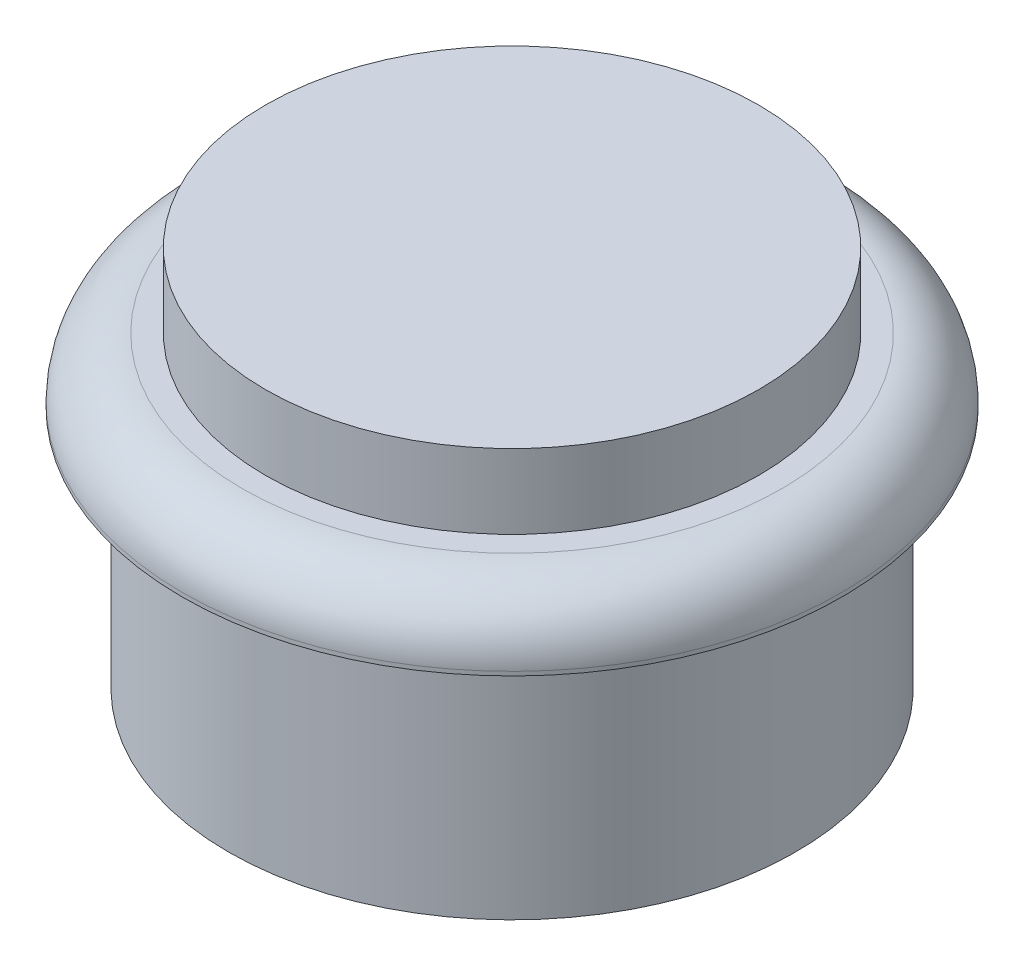
ISO-10303-21;
HEADER;
FILE_DESCRIPTION(('STEP AP214'),'2;1');
FILE_NAME('part.step','',(''),(''),'','','');
FILE_SCHEMA(('AUTOMOTIVE_DESIGN { 1 0 10303 214 1 1 1 1 }'));
ENDSEC;
DATA;
#1=APPLICATION_CONTEXT('core data for automotive mechanical design processes');
#2=APPLICATION_PROTOCOL_DEFINITION('international standard','automotive_design',2000,#1);
#3=PRODUCT_CONTEXT('',#1,'mechanical');
#4=PRODUCT('Part','Part','',(#3));
#5=PRODUCT_RELATED_PRODUCT_CATEGORY('part','',(#4));
#6=PRODUCT_DEFINITION_FORMATION('','',#4);
#7=PRODUCT_DEFINITION_CONTEXT('part definition',#1,'design');
#8=PRODUCT_DEFINITION('design','',#6,#7);
#9=PRODUCT_DEFINITION_SHAPE('','',#8);
#10=(LENGTH_UNIT() NAMED_UNIT(*) SI_UNIT(.MILLI.,.METRE.));
#11=(NAMED_UNIT(*) PLANE_ANGLE_UNIT() SI_UNIT($,.RADIAN.));
#12=(NAMED_UNIT(*) SI_UNIT($,.STERADIAN.) SOLID_ANGLE_UNIT());
#13=UNCERTAINTY_MEASURE_WITH_UNIT(LENGTH_MEASURE(1.E-05),#10,'distance_accuracy_value','');
#14=(GEOMETRIC_REPRESENTATION_CONTEXT(3) GLOBAL_UNCERTAINTY_ASSIGNED_CONTEXT((#13)) GLOBAL_UNIT_ASSIGNED_CONTEXT((#10,
#11,#12)) REPRESENTATION_CONTEXT('',''));
#15=CARTESIAN_POINT('',(0.,0.,0.));
#16=DIRECTION('',(0.,0.,1.));
#17=DIRECTION('',(1.,0.,0.));
#18=AXIS2_PLACEMENT_3D('',#15,#16,#17);
#19=CARTESIAN_POINT('',(0.,-12.2,0.));
#20=DIRECTION('',(0.,1.,0.));
#21=DIRECTION('',(0.,0.,1.));
#22=AXIS2_PLACEMENT_3D('',#19,#20,#21);
#23=CYLINDRICAL_SURFACE('',#22,14.2);
#24=CARTESIAN_POINT('',(0.,-12.2,0.));
#25=DIRECTION('',(0.,1.,0.));
#26=DIRECTION('',(0.,0.,1.));
#27=AXIS2_PLACEMENT_3D('',#24,#25,#26);
#28=CIRCLE('',#27,14.2);
#29=CARTESIAN_POINT('',(0.,-12.2,14.2));
#30=VERTEX_POINT('',#29);
#31=EDGE_CURVE('E48',#30,#30,#28,.T.);
#32=ORIENTED_EDGE('',*,*,#31,.T.);
#33=EDGE_LOOP('',(#32));
#34=FACE_BOUND('',#33,.T.);
#35=CARTESIAN_POINT('',(0.,0.,0.));
#36=DIRECTION('',(0.,1.,0.));
#37=DIRECTION('',(0.,0.,1.));
#38=AXIS2_PLACEMENT_3D('',#35,#36,#37);
#39=CIRCLE('',#38,14.2);
#40=CARTESIAN_POINT('',(0.,0.,14.2));
#41=VERTEX_POINT('',#40);
#42=EDGE_CURVE('E52',#41,#41,#39,.T.);
#43=ORIENTED_EDGE('',*,*,#42,.F.);
#44=EDGE_LOOP('',(#43));
#45=FACE_BOUND('',#44,.T.);
#46=ADVANCED_FACE('F37',(#34,#45),#23,.T.);
#47=CARTESIAN_POINT('',(0.,-12.2,0.));
#48=DIRECTION('',(0.,1.,0.));
#49=DIRECTION('',(0.,0.,1.));
#50=AXIS2_PLACEMENT_3D('',#47,#48,#49);
#51=PLANE('',#50);
#52=ORIENTED_EDGE('',*,*,#31,.F.);
#53=EDGE_LOOP('',(#52));
#54=FACE_BOUND('',#53,.T.);
#55=ADVANCED_FACE('F87',(#54),#51,.F.);
#56=CARTESIAN_POINT('',(0.,3.2,0.));
#57=DIRECTION('',(0.,-1.,0.));
#58=DIRECTION('',(0.,0.,-1.));
#59=AXIS2_PLACEMENT_3D('',#56,#57,#58);
#60=CYLINDRICAL_SURFACE('',#59,16.5);
#61=CARTESIAN_POINT('',(0.,0.2,0.));
#62=DIRECTION('',(0.,1.,0.));
#63=DIRECTION('',(0.,0.,1.));
#64=AXIS2_PLACEMENT_3D('',#61,#62,#63);
#65=CIRCLE('',#64,16.5);
#66=CARTESIAN_POINT('',(0.,0.2,16.5));
#67=VERTEX_POINT('',#66);
#68=EDGE_CURVE('E10',#67,#67,#65,.F.);
#69=ORIENTED_EDGE('',*,*,#68,.T.);
#70=EDGE_LOOP('',(#69));
#71=FACE_BOUND('',#70,.T.);
#72=CARTESIAN_POINT('',(0.,0.,0.));
#73=DIRECTION('',(0.,1.,0.));
#74=DIRECTION('',(0.,0.,1.));
#75=AXIS2_PLACEMENT_3D('',#72,#73,#74);
#76=CIRCLE('',#75,16.5);
#77=CARTESIAN_POINT('',(0.,0.,16.5));
#78=VERTEX_POINT('',#77);
#79=EDGE_CURVE('E56',#78,#78,#76,.T.);
#80=ORIENTED_EDGE('',*,*,#79,.T.);
#81=EDGE_LOOP('',(#80));
#82=FACE_BOUND('',#81,.T.);
#83=ADVANCED_FACE('F78',(#71,#82),#60,.T.);
#84=CARTESIAN_POINT('',(0.,3.2,0.));
#85=DIRECTION('',(0.,1.,0.));
#86=DIRECTION('',(0.,0.,1.));
#87=AXIS2_PLACEMENT_3D('',#84,#85,#86);
#88=PLANE('',#87);
#89=CARTESIAN_POINT('',(0.,3.2,0.));
#90=DIRECTION('',(0.,1.,0.));
#91=DIRECTION('',(0.,0.,1.));
#92=AXIS2_PLACEMENT_3D('',#89,#90,#91);
#93=CIRCLE('',#92,12.345);
#94=CARTESIAN_POINT('',(0.,3.2,12.345));
#95=VERTEX_POINT('',#94);
#96=EDGE_CURVE('E61',#95,#95,#93,.T.);
#97=ORIENTED_EDGE('',*,*,#96,.F.);
#98=EDGE_LOOP('',(#97));
#99=FACE_BOUND('',#98,.T.);
#100=CARTESIAN_POINT('',(0.,3.2,0.));
#101=DIRECTION('',(0.,1.,0.));
#102=DIRECTION('',(0.,0.,1.));
#103=AXIS2_PLACEMENT_3D('',#100,#101,#102);
#104=CIRCLE('',#103,13.5);
#105=CARTESIAN_POINT('',(0.,3.2,13.5));
#106=VERTEX_POINT('',#105);
#107=EDGE_CURVE('E44',#106,#106,#104,.T.);
#108=ORIENTED_EDGE('',*,*,#107,.T.);
#109=EDGE_LOOP('',(#108));
#110=FACE_BOUND('',#109,.T.);
#111=ADVANCED_FACE('F75',(#99,#110),#88,.T.);
#112=CARTESIAN_POINT('',(0.,0.,0.));
#113=DIRECTION('',(0.,1.,0.));
#114=DIRECTION('',(0.,0.,1.));
#115=AXIS2_PLACEMENT_3D('',#112,#113,#114);
#116=PLANE('',#115);
#117=ORIENTED_EDGE('',*,*,#42,.T.);
#118=EDGE_LOOP('',(#117));
#119=FACE_BOUND('',#118,.T.);
#120=ORIENTED_EDGE('',*,*,#79,.F.);
#121=EDGE_LOOP('',(#120));
#122=FACE_BOUND('',#121,.T.);
#123=ADVANCED_FACE('F77',(#119,#122),#116,.F.);
#124=CARTESIAN_POINT('',(0.,0.2,0.));
#125=DIRECTION('',(0.,1.,0.));
#126=DIRECTION('',(0.,0.,1.));
#127=AXIS2_PLACEMENT_3D('',#124,#125,#126);
#128=TOROIDAL_SURFACE('',#127,13.5,3.);
#129=ORIENTED_EDGE('',*,*,#68,.F.);
#130=EDGE_LOOP('',(#129));
#131=FACE_BOUND('',#130,.T.);
#132=ORIENTED_EDGE('',*,*,#107,.F.);
#133=EDGE_LOOP('',(#132));
#134=FACE_BOUND('',#133,.T.);
#135=ADVANCED_FACE('F39',(#131,#134),#128,.T.);
#136=CARTESIAN_POINT('',(0.,6.92,0.));
#137=DIRECTION('',(0.,-1.,0.));
#138=DIRECTION('',(0.,0.,-1.));
#139=AXIS2_PLACEMENT_3D('',#136,#137,#138);
#140=CYLINDRICAL_SURFACE('',#139,12.345);
#141=CARTESIAN_POINT('',(0.,6.92,0.));
#142=DIRECTION('',(0.,1.,0.));
#143=DIRECTION('',(0.,0.,1.));
#144=AXIS2_PLACEMENT_3D('',#141,#142,#143);
#145=CIRCLE('',#144,12.345);
#146=CARTESIAN_POINT('',(0.,6.92,12.345));
#147=VERTEX_POINT('',#146);
#148=EDGE_CURVE('E60',#147,#147,#145,.T.);
#149=ORIENTED_EDGE('',*,*,#148,.F.);
#150=EDGE_LOOP('',(#149));
#151=FACE_BOUND('',#150,.T.);
#152=ORIENTED_EDGE('',*,*,#96,.T.);
#153=EDGE_LOOP('',(#152));
#154=FACE_BOUND('',#153,.T.);
#155=ADVANCED_FACE('F69',(#151,#154),#140,.T.);
#156=CARTESIAN_POINT('',(0.,6.92,0.));
#157=DIRECTION('',(0.,1.,0.));
#158=DIRECTION('',(0.,0.,1.));
#159=AXIS2_PLACEMENT_3D('',#156,#157,#158);
#160=PLANE('',#159);
#161=ORIENTED_EDGE('',*,*,#148,.T.);
#162=EDGE_LOOP('',(#161));
#163=FACE_BOUND('',#162,.T.);
#164=ADVANCED_FACE('F67',(#163),#160,.T.);
#165=CLOSED_SHELL('',(#46,#55,#83,#111,#123,#135,#155,#164));
#166=MANIFOLD_SOLID_BREP('B2',#165);
#167=ADVANCED_BREP_SHAPE_REPRESENTATION('',(#18,#166),#14);
#168=SHAPE_DEFINITION_REPRESENTATION(#9,#167);
ENDSEC;
END-ISO-10303-21;
